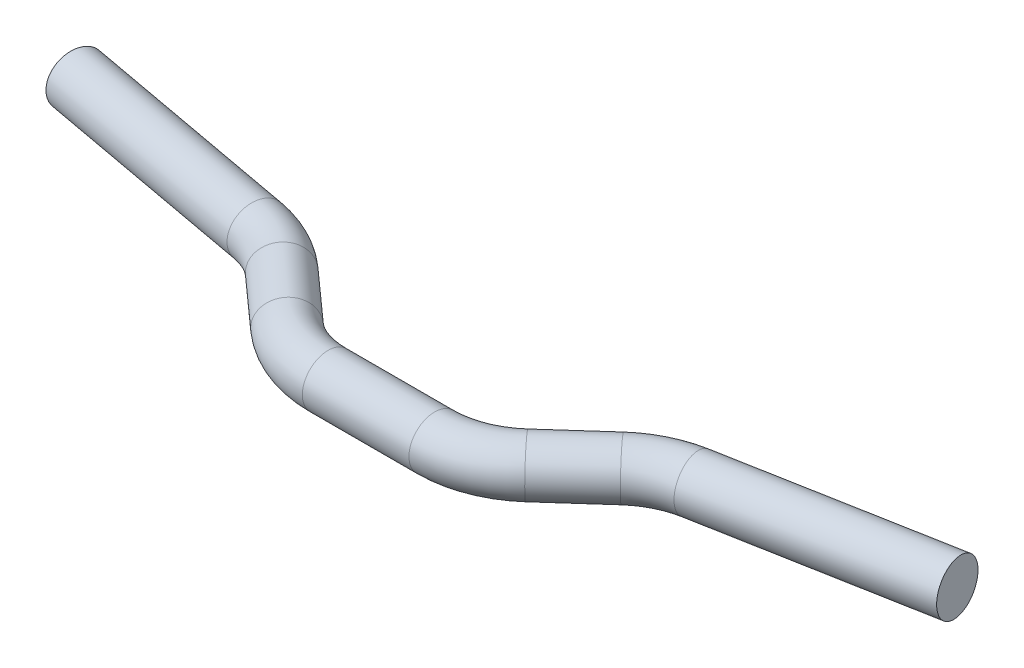
ISO-10303-21;
HEADER;
FILE_DESCRIPTION(('STEP AP214'),'2;1');
FILE_NAME('part.step','',(''),(''),'','','');
FILE_SCHEMA(('AUTOMOTIVE_DESIGN { 1 0 10303 214 1 1 1 1 }'));
ENDSEC;
DATA;
#1=APPLICATION_CONTEXT('core data for automotive mechanical design processes');
#2=APPLICATION_PROTOCOL_DEFINITION('international standard','automotive_design',2000,#1);
#3=PRODUCT_CONTEXT('',#1,'mechanical');
#4=PRODUCT('Part','Part','',(#3));
#5=PRODUCT_RELATED_PRODUCT_CATEGORY('part','',(#4));
#6=PRODUCT_DEFINITION_FORMATION('','',#4);
#7=PRODUCT_DEFINITION_CONTEXT('part definition',#1,'design');
#8=PRODUCT_DEFINITION('design','',#6,#7);
#9=PRODUCT_DEFINITION_SHAPE('','',#8);
#10=(LENGTH_UNIT() NAMED_UNIT(*) SI_UNIT(.MILLI.,.METRE.));
#11=(NAMED_UNIT(*) PLANE_ANGLE_UNIT() SI_UNIT($,.RADIAN.));
#12=(NAMED_UNIT(*) SI_UNIT($,.STERADIAN.) SOLID_ANGLE_UNIT());
#13=UNCERTAINTY_MEASURE_WITH_UNIT(LENGTH_MEASURE(1.E-05),#10,'distance_accuracy_value','');
#14=(GEOMETRIC_REPRESENTATION_CONTEXT(3) GLOBAL_UNCERTAINTY_ASSIGNED_CONTEXT((#13)) GLOBAL_UNIT_ASSIGNED_CONTEXT((#10,
#11,#12)) REPRESENTATION_CONTEXT('',''));
#15=CARTESIAN_POINT('',(0.,0.,0.));
#16=DIRECTION('',(0.,0.,1.));
#17=DIRECTION('',(1.,0.,0.));
#18=AXIS2_PLACEMENT_3D('',#15,#16,#17);
#19=CARTESIAN_POINT('',(420.225933162001,0.,-3.05234146406469));
#20=DIRECTION('',(0.983519720012622,0.,-0.180800885911253));
#21=DIRECTION('',(-0.180800885911253,0.,-0.983519720012622));
#22=AXIS2_PLACEMENT_3D('',#19,#20,#21);
#23=CYLINDRICAL_SURFACE('',#22,15.5);
#24=CARTESIAN_POINT('',(420.225933162001,0.,-3.05234146406469));
#25=DIRECTION('',(0.983519720012622,0.,-0.180800885911252));
#26=DIRECTION('',(-0.180800885911252,0.,-0.983519720012622));
#27=AXIS2_PLACEMENT_3D('',#24,#25,#26);
#28=CIRCLE('',#27,15.5);
#29=CARTESIAN_POINT('',(417.423519430376,0.,-18.2968971242603));
#30=VERTEX_POINT('',#29);
#31=EDGE_CURVE('E37',#30,#30,#28,.T.);
#32=ORIENTED_EDGE('',*,*,#31,.T.);
#33=EDGE_LOOP('',(#32));
#34=FACE_BOUND('',#33,.T.);
#35=CARTESIAN_POINT('',(553.621821921122,0.,-27.57456951279));
#36=DIRECTION('',(0.983519720012622,0.,-0.180800885911252));
#37=DIRECTION('',(-0.180800885911252,0.,-0.983519720012622));
#38=AXIS2_PLACEMENT_3D('',#35,#36,#37);
#39=CIRCLE('',#38,15.5);
#40=CARTESIAN_POINT('',(550.819408189497,0.,-42.8191251729856));
#41=VERTEX_POINT('',#40);
#42=EDGE_CURVE('E10',#41,#41,#39,.T.);
#43=ORIENTED_EDGE('',*,*,#42,.F.);
#44=EDGE_LOOP('',(#43));
#45=FACE_BOUND('',#44,.T.);
#46=ADVANCED_FACE('F31',(#34,#45),#23,.T.);
#47=CARTESIAN_POINT('',(431.073986316676,0.,55.9588417366926));
#48=DIRECTION('',(0.,-1.,0.));
#49=DIRECTION('',(0.,0.,-1.));
#50=AXIS2_PLACEMENT_3D('',#47,#48,#49);
#51=TOROIDAL_SURFACE('',#50,60.,15.5);
#52=CARTESIAN_POINT('',(391.045615515825,0.,11.2628740099547));
#53=DIRECTION('',(0.744932795445632,0.,-0.667139513347513));
#54=DIRECTION('',(-0.667139513347513,0.,-0.744932795445632));
#55=AXIS2_PLACEMENT_3D('',#52,#53,#54);
#56=CIRCLE('',#55,15.5);
#57=CARTESIAN_POINT('',(380.704953058939,0.,-0.2835843194526));
#58=VERTEX_POINT('',#57);
#59=EDGE_CURVE('E41',#58,#58,#56,.T.);
#60=CARTESIAN_POINT('',(431.073986316676,0.,55.9588417366926));
#61=DIRECTION('',(0.,-1.,0.));
#62=DIRECTION('',(0.,0.,-1.));
#63=AXIS2_PLACEMENT_3D('',#60,#61,#62);
#64=CIRCLE('',#63,75.5);
#65=EDGE_CURVE('',#58,#30,#64,.T.);
#66=ORIENTED_EDGE('',*,*,#59,.T.);
#67=ORIENTED_EDGE('',*,*,#31,.F.);
#68=ORIENTED_EDGE('',*,*,#65,.T.);
#69=ORIENTED_EDGE('',*,*,#65,.F.);
#70=EDGE_LOOP('',(#66,#68,#67,#69));
#71=FACE_BOUND('',#70,.T.);
#72=ADVANCED_FACE('F102',(#71),#51,.T.);
#73=CARTESIAN_POINT('',(360.710414808848,0.,38.4301717322215));
#74=DIRECTION('',(0.744932795445633,0.,-0.667139513347512));
#75=DIRECTION('',(-0.667139513347512,0.,-0.744932795445633));
#76=AXIS2_PLACEMENT_3D('',#73,#74,#75);
#77=CYLINDRICAL_SURFACE('',#76,15.5);
#78=CARTESIAN_POINT('',(360.710414808848,0.,38.4301717322215));
#79=DIRECTION('',(0.744932795445632,0.,-0.667139513347513));
#80=DIRECTION('',(-0.667139513347513,0.,-0.744932795445632));
#81=AXIS2_PLACEMENT_3D('',#78,#79,#80);
#82=CIRCLE('',#81,15.5);
#83=CARTESIAN_POINT('',(371.051077265734,0.,49.9766300616289));
#84=VERTEX_POINT('',#83);
#85=EDGE_CURVE('E45',#84,#84,#82,.T.);
#86=ORIENTED_EDGE('',*,*,#85,.T.);
#87=EDGE_LOOP('',(#86));
#88=FACE_BOUND('',#87,.T.);
#89=ORIENTED_EDGE('',*,*,#59,.F.);
#90=EDGE_LOOP('',(#89));
#91=FACE_BOUND('',#90,.T.);
#92=ADVANCED_FACE('F106',(#88,#91),#77,.T.);
#93=CARTESIAN_POINT('',(320.682044007997,0.,-6.26579599451642));
#94=DIRECTION('',(0.,1.,0.));
#95=DIRECTION('',(0.,0.,1.));
#96=AXIS2_PLACEMENT_3D('',#93,#94,#95);
#97=TOROIDAL_SURFACE('',#96,60.,15.5);
#98=CARTESIAN_POINT('',(320.682044007997,0.,53.7342040054836));
#99=DIRECTION('',(1.,0.,0.));
#100=DIRECTION('',(0.,0.,-1.));
#101=AXIS2_PLACEMENT_3D('',#98,#99,#100);
#102=CIRCLE('',#101,15.5);
#103=CARTESIAN_POINT('',(320.682044007997,0.,69.2342040054836));
#104=VERTEX_POINT('',#103);
#105=EDGE_CURVE('E50',#104,#104,#102,.T.);
#106=CARTESIAN_POINT('',(320.682044007997,0.,-6.26579599451642));
#107=DIRECTION('',(0.,1.,0.));
#108=DIRECTION('',(0.,0.,1.));
#109=AXIS2_PLACEMENT_3D('',#106,#107,#108);
#110=CIRCLE('',#109,75.5);
#111=EDGE_CURVE('',#104,#84,#110,.T.);
#112=ORIENTED_EDGE('',*,*,#105,.T.);
#113=ORIENTED_EDGE('',*,*,#85,.F.);
#114=ORIENTED_EDGE('',*,*,#111,.T.);
#115=ORIENTED_EDGE('',*,*,#111,.F.);
#116=EDGE_LOOP('',(#112,#114,#113,#115));
#117=FACE_BOUND('',#116,.T.);
#118=ADVANCED_FACE('F112',(#117),#97,.T.);
#119=CARTESIAN_POINT('',(320.682044007997,0.,53.7342040054836));
#120=DIRECTION('',(-1.,0.,0.));
#121=DIRECTION('',(0.,0.,1.));
#122=AXIS2_PLACEMENT_3D('',#119,#120,#121);
#123=CYLINDRICAL_SURFACE('',#122,15.5);
#124=ORIENTED_EDGE('',*,*,#105,.F.);
#125=EDGE_LOOP('',(#124));
#126=FACE_BOUND('',#125,.T.);
#127=CARTESIAN_POINT('',(256.561599834247,0.,53.7342040054836));
#128=DIRECTION('',(1.,0.,0.));
#129=DIRECTION('',(0.,0.,-1.));
#130=AXIS2_PLACEMENT_3D('',#127,#128,#129);
#131=CIRCLE('',#130,15.5);
#132=CARTESIAN_POINT('',(256.561599834247,0.,69.2342040054836));
#133=VERTEX_POINT('',#132);
#134=EDGE_CURVE('E65',#133,#133,#131,.T.);
#135=ORIENTED_EDGE('',*,*,#134,.T.);
#136=EDGE_LOOP('',(#135));
#137=FACE_BOUND('',#136,.T.);
#138=ADVANCED_FACE('F69',(#126,#137),#123,.T.);
#139=CARTESIAN_POINT('',(553.621821921122,0.,-27.57456951279));
#140=DIRECTION('',(0.983519720012622,0.,-0.180800885911252));
#141=DIRECTION('',(-0.180800885911252,0.,-0.983519720012622));
#142=AXIS2_PLACEMENT_3D('',#139,#140,#141);
#143=PLANE('',#142);
#144=ORIENTED_EDGE('',*,*,#42,.T.);
#145=EDGE_LOOP('',(#144));
#146=FACE_BOUND('',#145,.T.);
#147=ADVANCED_FACE('F93',(#146),#143,.T.);
#148=CARTESIAN_POINT('',(157.017710680243,0.,-3.05234146406468));
#149=DIRECTION('',(-0.983519720012622,0.,-0.180800885911253));
#150=DIRECTION('',(-0.180800885911253,0.,0.983519720012622));
#151=AXIS2_PLACEMENT_3D('',#148,#149,#150);
#152=CYLINDRICAL_SURFACE('',#151,15.5);
#153=CARTESIAN_POINT('',(157.017710680243,0.,-3.05234146406468));
#154=DIRECTION('',(0.983519720012622,0.,0.180800885911252));
#155=DIRECTION('',(0.180800885911252,0.,-0.983519720012622));
#156=AXIS2_PLACEMENT_3D('',#153,#154,#155);
#157=CIRCLE('',#156,15.5);
#158=CARTESIAN_POINT('',(159.820124411867,0.,-18.2968971242603));
#159=VERTEX_POINT('',#158);
#160=EDGE_CURVE('E56',#159,#159,#157,.T.);
#161=ORIENTED_EDGE('',*,*,#160,.F.);
#162=EDGE_LOOP('',(#161));
#163=FACE_BOUND('',#162,.T.);
#164=CARTESIAN_POINT('',(23.6218219211219,0.,-27.57456951279));
#165=DIRECTION('',(0.983519720012622,0.,0.180800885911252));
#166=DIRECTION('',(0.180800885911252,0.,-0.983519720012622));
#167=AXIS2_PLACEMENT_3D('',#164,#165,#166);
#168=CIRCLE('',#167,15.5);
#169=CARTESIAN_POINT('',(26.4242356527464,0.,-42.8191251729856));
#170=VERTEX_POINT('',#169);
#171=EDGE_CURVE('E53',#170,#170,#168,.T.);
#172=ORIENTED_EDGE('',*,*,#171,.T.);
#173=EDGE_LOOP('',(#172));
#174=FACE_BOUND('',#173,.T.);
#175=ADVANCED_FACE('F87',(#163,#174),#152,.T.);
#176=CARTESIAN_POINT('',(146.169657525568,0.,55.9588417366926));
#177=DIRECTION('',(0.,1.,0.));
#178=DIRECTION('',(0.,0.,1.));
#179=AXIS2_PLACEMENT_3D('',#176,#177,#178);
#180=TOROIDAL_SURFACE('',#179,59.9999999999999,15.5);
#181=CARTESIAN_POINT('',(186.198028326418,0.,11.2628740099547));
#182=DIRECTION('',(0.744932795445632,0.,0.667139513347513));
#183=DIRECTION('',(0.667139513347513,0.,-0.744932795445632));
#184=AXIS2_PLACEMENT_3D('',#181,#182,#183);
#185=CIRCLE('',#184,15.5);
#186=CARTESIAN_POINT('',(196.538690783305,0.,-0.283584319452614));
#187=VERTEX_POINT('',#186);
#188=EDGE_CURVE('E59',#187,#187,#185,.T.);
#189=CARTESIAN_POINT('',(146.169657525568,0.,55.9588417366926));
#190=DIRECTION('',(0.,1.,0.));
#191=DIRECTION('',(0.,0.,1.));
#192=AXIS2_PLACEMENT_3D('',#189,#190,#191);
#193=CIRCLE('',#192,75.4999999999999);
#194=EDGE_CURVE('',#187,#159,#193,.T.);
#195=ORIENTED_EDGE('',*,*,#188,.F.);
#196=ORIENTED_EDGE('',*,*,#160,.T.);
#197=ORIENTED_EDGE('',*,*,#194,.T.);
#198=ORIENTED_EDGE('',*,*,#194,.F.);
#199=EDGE_LOOP('',(#195,#197,#196,#198));
#200=FACE_BOUND('',#199,.T.);
#201=ADVANCED_FACE('F81',(#200),#180,.T.);
#202=CARTESIAN_POINT('',(216.533229033396,0.,38.4301717322215));
#203=DIRECTION('',(-0.744932795445633,0.,-0.667139513347512));
#204=DIRECTION('',(-0.667139513347512,0.,0.744932795445633));
#205=AXIS2_PLACEMENT_3D('',#202,#203,#204);
#206=CYLINDRICAL_SURFACE('',#205,15.5);
#207=CARTESIAN_POINT('',(216.533229033396,0.,38.4301717322215));
#208=DIRECTION('',(0.744932795445632,0.,0.667139513347513));
#209=DIRECTION('',(0.667139513347513,0.,-0.744932795445632));
#210=AXIS2_PLACEMENT_3D('',#207,#208,#209);
#211=CIRCLE('',#210,15.5);
#212=CARTESIAN_POINT('',(206.192566576509,0.,49.9766300616288));
#213=VERTEX_POINT('',#212);
#214=EDGE_CURVE('E62',#213,#213,#211,.T.);
#215=ORIENTED_EDGE('',*,*,#214,.F.);
#216=EDGE_LOOP('',(#215));
#217=FACE_BOUND('',#216,.T.);
#218=ORIENTED_EDGE('',*,*,#188,.T.);
#219=EDGE_LOOP('',(#218));
#220=FACE_BOUND('',#219,.T.);
#221=ADVANCED_FACE('F75',(#217,#220),#206,.T.);
#222=CARTESIAN_POINT('',(256.561599834247,0.,-6.26579599451642));
#223=DIRECTION('',(0.,-1.,0.));
#224=DIRECTION('',(0.,0.,-1.));
#225=AXIS2_PLACEMENT_3D('',#222,#223,#224);
#226=TOROIDAL_SURFACE('',#225,60.,15.5);
#227=CARTESIAN_POINT('',(256.561599834247,0.,-6.26579599451642));
#228=DIRECTION('',(0.,-1.,0.));
#229=DIRECTION('',(0.,0.,-1.));
#230=AXIS2_PLACEMENT_3D('',#227,#228,#229);
#231=CIRCLE('',#230,75.5);
#232=EDGE_CURVE('',#133,#213,#231,.T.);
#233=ORIENTED_EDGE('',*,*,#134,.F.);
#234=ORIENTED_EDGE('',*,*,#214,.T.);
#235=ORIENTED_EDGE('',*,*,#232,.T.);
#236=ORIENTED_EDGE('',*,*,#232,.F.);
#237=EDGE_LOOP('',(#233,#235,#234,#236));
#238=FACE_BOUND('',#237,.T.);
#239=ADVANCED_FACE('F71',(#238),#226,.T.);
#240=CARTESIAN_POINT('',(23.6218219211219,0.,-27.57456951279));
#241=DIRECTION('',(-0.983519720012622,0.,-0.180800885911252));
#242=DIRECTION('',(0.180800885911252,0.,-0.983519720012622));
#243=AXIS2_PLACEMENT_3D('',#240,#241,#242);
#244=PLANE('',#243);
#245=ORIENTED_EDGE('',*,*,#171,.F.);
#246=EDGE_LOOP('',(#245));
#247=FACE_BOUND('',#246,.T.);
#248=ADVANCED_FACE('F74',(#247),#244,.T.);
#249=CLOSED_SHELL('',(#46,#72,#92,#118,#138,#147,#175,#201,#221,#239,#248));
#250=MANIFOLD_SOLID_BREP('B2',#249);
#251=ADVANCED_BREP_SHAPE_REPRESENTATION('',(#18,#250),#14);
#252=SHAPE_DEFINITION_REPRESENTATION(#9,#251);
ENDSEC;
END-ISO-10303-21;
